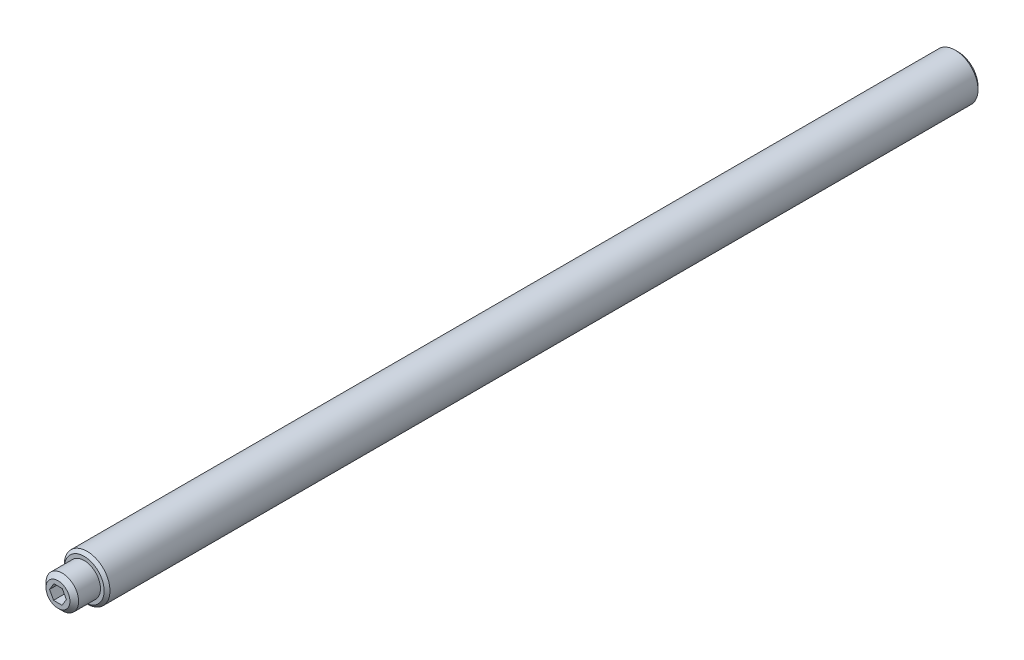
ISO-10303-21;
HEADER;
FILE_DESCRIPTION(('STEP AP214'),'2;1');
FILE_NAME('part.step','',(''),(''),'','','');
FILE_SCHEMA(('AUTOMOTIVE_DESIGN { 1 0 10303 214 1 1 1 1 }'));
ENDSEC;
DATA;
#1=APPLICATION_CONTEXT('core data for automotive mechanical design processes');
#2=APPLICATION_PROTOCOL_DEFINITION('international standard','automotive_design',2000,#1);
#3=PRODUCT_CONTEXT('',#1,'mechanical');
#4=PRODUCT('Part','Part','',(#3));
#5=PRODUCT_RELATED_PRODUCT_CATEGORY('part','',(#4));
#6=PRODUCT_DEFINITION_FORMATION('','',#4);
#7=PRODUCT_DEFINITION_CONTEXT('part definition',#1,'design');
#8=PRODUCT_DEFINITION('design','',#6,#7);
#9=PRODUCT_DEFINITION_SHAPE('','',#8);
#10=(LENGTH_UNIT() NAMED_UNIT(*) SI_UNIT(.MILLI.,.METRE.));
#11=(NAMED_UNIT(*) PLANE_ANGLE_UNIT() SI_UNIT($,.RADIAN.));
#12=(NAMED_UNIT(*) SI_UNIT($,.STERADIAN.) SOLID_ANGLE_UNIT());
#13=UNCERTAINTY_MEASURE_WITH_UNIT(LENGTH_MEASURE(1.E-05),#10,'distance_accuracy_value','');
#14=(GEOMETRIC_REPRESENTATION_CONTEXT(3) GLOBAL_UNCERTAINTY_ASSIGNED_CONTEXT((#13)) GLOBAL_UNIT_ASSIGNED_CONTEXT((#10,
#11,#12)) REPRESENTATION_CONTEXT('',''));
#15=CARTESIAN_POINT('',(0.,0.,0.));
#16=DIRECTION('',(0.,0.,1.));
#17=DIRECTION('',(1.,0.,0.));
#18=AXIS2_PLACEMENT_3D('',#15,#16,#17);
#19=CARTESIAN_POINT('',(0.,0.,38.1));
#20=DIRECTION('',(0.,0.,-1.));
#21=DIRECTION('',(-1.,0.,0.));
#22=AXIS2_PLACEMENT_3D('',#19,#20,#21);
#23=CYLINDRICAL_SURFACE('',#22,1.9939);
#24=CARTESIAN_POINT('',(0.,0.,37.846));
#25=DIRECTION('',(0.,0.,1.));
#26=DIRECTION('',(1.,0.,0.));
#27=AXIS2_PLACEMENT_3D('',#24,#25,#26);
#28=CIRCLE('',#27,1.9939);
#29=CARTESIAN_POINT('',(-1.9939,0.,37.846));
#30=VERTEX_POINT('',#29);
#31=EDGE_CURVE('P0_E11',#30,#30,#28,.F.);
#32=CARTESIAN_POINT('',(0.,0.,-37.846));
#33=DIRECTION('',(0.,0.,1.));
#34=DIRECTION('',(1.,0.,0.));
#35=AXIS2_PLACEMENT_3D('',#32,#33,#34);
#36=CIRCLE('',#35,1.9939);
#37=CARTESIAN_POINT('',(-1.9939,0.,-37.846));
#38=VERTEX_POINT('',#37);
#39=EDGE_CURVE('P0_E63',#38,#38,#36,.T.);
#40=CARTESIAN_POINT('',(-1.9939,0.,37.846));
#41=CARTESIAN_POINT('',(-1.9939,0.,37.0575416666667));
#42=CARTESIAN_POINT('',(-1.9939,0.,36.2690833333334));
#43=CARTESIAN_POINT('',(-1.9939,0.,34.6921666666667));
#44=CARTESIAN_POINT('',(-1.9939,0.,33.9037083333334));
#45=CARTESIAN_POINT('',(-1.9939,0.,32.3267916666667));
#46=CARTESIAN_POINT('',(-1.9939,0.,31.5383333333334));
#47=CARTESIAN_POINT('',(-1.9939,0.,29.9614166666667));
#48=CARTESIAN_POINT('',(-1.9939,0.,29.1729583333334));
#49=CARTESIAN_POINT('',(-1.9939,0.,27.5960416666667));
#50=CARTESIAN_POINT('',(-1.9939,0.,26.8075833333334));
#51=CARTESIAN_POINT('',(-1.9939,0.,25.2306666666667));
#52=CARTESIAN_POINT('',(-1.9939,0.,24.4422083333334));
#53=CARTESIAN_POINT('',(-1.9939,0.,22.8652916666667));
#54=CARTESIAN_POINT('',(-1.9939,0.,22.0768333333334));
#55=CARTESIAN_POINT('',(-1.9939,0.,20.4999166666667));
#56=CARTESIAN_POINT('',(-1.9939,0.,19.7114583333334));
#57=CARTESIAN_POINT('',(-1.9939,0.,18.1345416666667));
#58=CARTESIAN_POINT('',(-1.9939,0.,17.3460833333334));
#59=CARTESIAN_POINT('',(-1.9939,0.,15.7691666666667));
#60=CARTESIAN_POINT('',(-1.9939,0.,14.9807083333334));
#61=CARTESIAN_POINT('',(-1.9939,0.,13.4037916666667));
#62=CARTESIAN_POINT('',(-1.9939,0.,12.6153333333334));
#63=CARTESIAN_POINT('',(-1.9939,0.,11.0384166666667));
#64=CARTESIAN_POINT('',(-1.9939,0.,10.2499583333334));
#65=CARTESIAN_POINT('',(-1.9939,0.,8.6730416666667));
#66=CARTESIAN_POINT('',(-1.9939,0.,7.88458333333336));
#67=CARTESIAN_POINT('',(-1.9939,0.,6.30766666666669));
#68=CARTESIAN_POINT('',(-1.9939,0.,5.51920833333336));
#69=CARTESIAN_POINT('',(-1.9939,0.,3.94229166666669));
#70=CARTESIAN_POINT('',(-1.9939,0.,3.15383333333336));
#71=CARTESIAN_POINT('',(-1.9939,0.,1.5769166666667));
#72=CARTESIAN_POINT('',(-1.9939,0.,0.788458333333362));
#73=CARTESIAN_POINT('',(-1.9939,0.,-0.788458333333307));
#74=CARTESIAN_POINT('',(-1.9939,0.,-1.57691666666664));
#75=CARTESIAN_POINT('',(-1.9939,0.,-3.15383333333331));
#76=CARTESIAN_POINT('',(-1.9939,0.,-3.94229166666664));
#77=CARTESIAN_POINT('',(-1.9939,0.,-5.51920833333331));
#78=CARTESIAN_POINT('',(-1.9939,0.,-6.30766666666664));
#79=CARTESIAN_POINT('',(-1.9939,0.,-7.88458333333331));
#80=CARTESIAN_POINT('',(-1.9939,0.,-8.67304166666664));
#81=CARTESIAN_POINT('',(-1.9939,0.,-10.2499583333333));
#82=CARTESIAN_POINT('',(-1.9939,0.,-11.0384166666666));
#83=CARTESIAN_POINT('',(-1.9939,0.,-12.6153333333333));
#84=CARTESIAN_POINT('',(-1.9939,0.,-13.4037916666666));
#85=CARTESIAN_POINT('',(-1.9939,0.,-14.9807083333333));
#86=CARTESIAN_POINT('',(-1.9939,0.,-15.7691666666666));
#87=CARTESIAN_POINT('',(-1.9939,0.,-17.3460833333333));
#88=CARTESIAN_POINT('',(-1.9939,0.,-18.1345416666666));
#89=CARTESIAN_POINT('',(-1.9939,0.,-19.7114583333333));
#90=CARTESIAN_POINT('',(-1.9939,0.,-20.4999166666666));
#91=CARTESIAN_POINT('',(-1.9939,0.,-22.0768333333333));
#92=CARTESIAN_POINT('',(-1.9939,0.,-22.8652916666666));
#93=CARTESIAN_POINT('',(-1.9939,0.,-24.4422083333333));
#94=CARTESIAN_POINT('',(-1.9939,0.,-25.2306666666666));
#95=CARTESIAN_POINT('',(-1.9939,0.,-26.8075833333333));
#96=CARTESIAN_POINT('',(-1.9939,0.,-27.5960416666666));
#97=CARTESIAN_POINT('',(-1.9939,0.,-29.1729583333333));
#98=CARTESIAN_POINT('',(-1.9939,0.,-29.9614166666666));
#99=CARTESIAN_POINT('',(-1.9939,0.,-31.5383333333333));
#100=CARTESIAN_POINT('',(-1.9939,0.,-32.3267916666666));
#101=CARTESIAN_POINT('',(-1.9939,0.,-33.9037083333333));
#102=CARTESIAN_POINT('',(-1.9939,0.,-34.6921666666666));
#103=CARTESIAN_POINT('',(-1.9939,0.,-36.2690833333333));
#104=CARTESIAN_POINT('',(-1.9939,0.,-37.0575416666666));
#105=CARTESIAN_POINT('',(-1.9939,0.,-37.846));
#106=B_SPLINE_CURVE_WITH_KNOTS('',3,(#40,#41,#42,#43,#44,#45,#46,#47,#48,#49,#50,#51,#52,#53,
#54,#55,#56,#57,#58,#59,#60,#61,#62,#63,#64,#65,#66,#67,#68,#69,#70,#71,#72,#73,#74,#75,#76,#77,
#78,#79,#80,#81,#82,#83,#84,#85,#86,#87,#88,#89,#90,#91,#92,#93,#94,#95,#96,#97,#98,#99,#100,
#101,#102,#103,#104,#105),.UNSPECIFIED.,.F.,.F.,(4,2,2,2,2,2,2,2,2,2,2,2,2,2,2,2,2,2,2,2,2,2,2,
2,2,2,2,2,2,2,2,2,4),(0.,2.365375,4.73075,7.09612499999999,9.4615,11.826875,14.19225,16.557625,
18.923,21.288375,23.65375,26.019125,28.3845,30.749875,33.11525,35.480625,37.846,40.211375,
42.57675,44.942125,47.3075,49.672875,52.03825,54.403625,56.769,59.134375,61.49975,63.865125,
66.2305,68.595875,70.96125,73.326625,75.692),.UNSPECIFIED.);
#107=EDGE_CURVE('P0_BSEAM17',#30,#38,#106,.T.);
#108=ORIENTED_EDGE('',*,*,#31,.T.);
#109=ORIENTED_EDGE('',*,*,#39,.T.);
#110=ORIENTED_EDGE('',*,*,#107,.T.);
#111=ORIENTED_EDGE('',*,*,#107,.F.);
#112=EDGE_LOOP('',(#108,#110,#109,#111));
#113=FACE_BOUND('',#112,.T.);
#114=ADVANCED_FACE('P0_F17',(#113),#23,.T.);
#115=CARTESIAN_POINT('',(0.,0.,38.1));
#116=DIRECTION('',(0.,0.,1.));
#117=DIRECTION('',(1.,0.,0.));
#118=AXIS2_PLACEMENT_3D('',#115,#116,#117);
#119=PLANE('',#118);
#120=CARTESIAN_POINT('',(0.,0.,38.1));
#121=DIRECTION('',(0.,0.,1.));
#122=DIRECTION('',(1.,0.,0.));
#123=AXIS2_PLACEMENT_3D('',#120,#121,#122);
#124=CIRCLE('',#123,1.42239999999999);
#125=CARTESIAN_POINT('',(1.42239999999999,0.,38.1));
#126=VERTEX_POINT('',#125);
#127=EDGE_CURVE('P0_E60',#126,#126,#124,.T.);
#128=ORIENTED_EDGE('',*,*,#127,.F.);
#129=EDGE_LOOP('',(#128));
#130=FACE_BOUND('',#129,.T.);
#131=CARTESIAN_POINT('',(0.,0.,38.1));
#132=DIRECTION('',(0.,0.,1.));
#133=DIRECTION('',(1.,0.,0.));
#134=AXIS2_PLACEMENT_3D('',#131,#132,#133);
#135=CIRCLE('',#134,1.73990000000003);
#136=CARTESIAN_POINT('',(1.73990000000003,0.,38.1));
#137=VERTEX_POINT('',#136);
#138=EDGE_CURVE('P0_E25',#137,#137,#135,.T.);
#139=ORIENTED_EDGE('',*,*,#138,.T.);
#140=EDGE_LOOP('',(#139));
#141=FACE_BOUND('',#140,.T.);
#142=ADVANCED_FACE('P0_F71',(#130,#141),#119,.T.);
#143=CARTESIAN_POINT('',(0.,0.,-38.1));
#144=DIRECTION('',(0.,0.,1.));
#145=DIRECTION('',(1.,0.,0.));
#146=AXIS2_PLACEMENT_3D('',#143,#144,#145);
#147=PLANE('',#146);
#148=CARTESIAN_POINT('',(0.,0.,-38.1));
#149=DIRECTION('',(0.,0.,-1.));
#150=DIRECTION('',(-1.,0.,0.));
#151=AXIS2_PLACEMENT_3D('',#148,#149,#150);
#152=CIRCLE('',#151,1.42239999999999);
#153=CARTESIAN_POINT('',(-1.42239999999999,0.,-38.1));
#154=VERTEX_POINT('',#153);
#155=EDGE_CURVE('P0_E48',#154,#154,#152,.T.);
#156=ORIENTED_EDGE('',*,*,#155,.F.);
#157=EDGE_LOOP('',(#156));
#158=FACE_BOUND('',#157,.T.);
#159=CARTESIAN_POINT('',(0.,0.,-38.1));
#160=DIRECTION('',(0.,0.,1.));
#161=DIRECTION('',(1.,0.,0.));
#162=AXIS2_PLACEMENT_3D('',#159,#160,#161);
#163=CIRCLE('',#162,1.73989999999995);
#164=CARTESIAN_POINT('',(1.73989999999995,0.,-38.1));
#165=VERTEX_POINT('',#164);
#166=EDGE_CURVE('P0_E66',#165,#165,#163,.F.);
#167=ORIENTED_EDGE('',*,*,#166,.T.);
#168=EDGE_LOOP('',(#167));
#169=FACE_BOUND('',#168,.T.);
#170=ADVANCED_FACE('P0_F85',(#158,#169),#147,.F.);
#171=CARTESIAN_POINT('',(0.,0.,-37.846));
#172=DIRECTION('',(0.,0.,1.));
#173=DIRECTION('',(1.,0.,0.));
#174=AXIS2_PLACEMENT_3D('',#171,#172,#173);
#175=CONICAL_SURFACE('',#174,1.9939,0.785398163397463);
#176=ORIENTED_EDGE('',*,*,#166,.F.);
#177=EDGE_LOOP('',(#176));
#178=FACE_BOUND('',#177,.T.);
#179=ORIENTED_EDGE('',*,*,#39,.F.);
#180=EDGE_LOOP('',(#179));
#181=FACE_BOUND('',#180,.T.);
#182=ADVANCED_FACE('P0_F75',(#178,#181),#175,.T.);
#183=CARTESIAN_POINT('',(0.,0.,38.1));
#184=DIRECTION('',(0.,0.,-1.));
#185=DIRECTION('',(-1.,0.,0.));
#186=AXIS2_PLACEMENT_3D('',#183,#184,#185);
#187=CONICAL_SURFACE('',#186,1.73990000000003,0.785398163397449);
#188=ORIENTED_EDGE('',*,*,#31,.F.);
#189=EDGE_LOOP('',(#188));
#190=FACE_BOUND('',#189,.T.);
#191=ORIENTED_EDGE('',*,*,#138,.F.);
#192=EDGE_LOOP('',(#191));
#193=FACE_BOUND('',#192,.T.);
#194=ADVANCED_FACE('P0_F19',(#190,#193),#187,.T.);
#195=CARTESIAN_POINT('',(0.,0.,38.1));
#196=DIRECTION('',(0.,0.,1.));
#197=DIRECTION('',(1.,0.,0.));
#198=AXIS2_PLACEMENT_3D('',#195,#196,#197);
#199=CYLINDRICAL_SURFACE('',#198,1.4224);
#200=CARTESIAN_POINT('',(0.,0.,34.036));
#201=DIRECTION('',(0.,0.,1.));
#202=DIRECTION('',(1.,0.,0.));
#203=AXIS2_PLACEMENT_3D('',#200,#201,#202);
#204=CIRCLE('',#203,1.4224);
#205=CARTESIAN_POINT('',(1.4224,0.,34.036));
#206=VERTEX_POINT('',#205);
#207=EDGE_CURVE('P0_E57',#206,#206,#204,.T.);
#208=ORIENTED_EDGE('',*,*,#207,.F.);
#209=EDGE_LOOP('',(#208));
#210=FACE_BOUND('',#209,.T.);
#211=ORIENTED_EDGE('',*,*,#127,.T.);
#212=EDGE_LOOP('',(#211));
#213=FACE_BOUND('',#212,.T.);
#214=ADVANCED_FACE('P0_F74',(#210,#213),#199,.F.);
#215=CARTESIAN_POINT('',(1.1303,0.,34.036));
#216=DIRECTION('',(0.,0.,-1.));
#217=DIRECTION('',(-1.,0.,0.));
#218=AXIS2_PLACEMENT_3D('',#215,#216,#217);
#219=PLANE('',#218);
#220=CARTESIAN_POINT('',(0.,0.,34.036));
#221=DIRECTION('',(0.,0.,1.));
#222=DIRECTION('',(1.,0.,0.));
#223=AXIS2_PLACEMENT_3D('',#220,#221,#222);
#224=CIRCLE('',#223,1.1303);
#225=CARTESIAN_POINT('',(1.1303,0.,34.036));
#226=VERTEX_POINT('',#225);
#227=EDGE_CURVE('P0_E54',#226,#226,#224,.T.);
#228=ORIENTED_EDGE('',*,*,#227,.F.);
#229=EDGE_LOOP('',(#228));
#230=FACE_BOUND('',#229,.T.);
#231=ORIENTED_EDGE('',*,*,#207,.T.);
#232=EDGE_LOOP('',(#231));
#233=FACE_BOUND('',#232,.T.);
#234=ADVANCED_FACE('P0_F82',(#230,#233),#219,.F.);
#235=CARTESIAN_POINT('',(0.,0.,38.1));
#236=DIRECTION('',(0.,0.,1.));
#237=DIRECTION('',(1.,0.,0.));
#238=AXIS2_PLACEMENT_3D('',#235,#236,#237);
#239=CYLINDRICAL_SURFACE('',#238,1.1303);
#240=CARTESIAN_POINT('',(0.,0.,33.02));
#241=DIRECTION('',(0.,0.,1.));
#242=DIRECTION('',(1.,0.,0.));
#243=AXIS2_PLACEMENT_3D('',#240,#241,#242);
#244=CIRCLE('',#243,1.1303);
#245=CARTESIAN_POINT('',(1.1303,0.,33.02));
#246=VERTEX_POINT('',#245);
#247=EDGE_CURVE('P0_E51',#246,#246,#244,.T.);
#248=ORIENTED_EDGE('',*,*,#247,.F.);
#249=EDGE_LOOP('',(#248));
#250=FACE_BOUND('',#249,.T.);
#251=ORIENTED_EDGE('',*,*,#227,.T.);
#252=EDGE_LOOP('',(#251));
#253=FACE_BOUND('',#252,.T.);
#254=ADVANCED_FACE('P0_F103',(#250,#253),#239,.F.);
#255=CARTESIAN_POINT('',(0.,0.,33.02));
#256=DIRECTION('',(0.,0.,1.));
#257=DIRECTION('',(1.,0.,0.));
#258=AXIS2_PLACEMENT_3D('',#255,#256,#257);
#259=CONICAL_SURFACE('',#258,1.1303,1.02974425867665);
#260=CARTESIAN_POINT('',(0.,0.,32.3408472423131));
#261=VERTEX_POINT('',#260);
#262=VERTEX_LOOP('',#261);
#263=FACE_BOUND('',#262,.T.);
#264=ORIENTED_EDGE('',*,*,#247,.T.);
#265=EDGE_LOOP('',(#264));
#266=FACE_BOUND('',#265,.T.);
#267=ADVANCED_FACE('P0_F107',(#263,#266),#259,.F.);
#268=CARTESIAN_POINT('',(0.,0.,-38.1));
#269=DIRECTION('',(0.,0.,-1.));
#270=DIRECTION('',(-1.,0.,0.));
#271=AXIS2_PLACEMENT_3D('',#268,#269,#270);
#272=CYLINDRICAL_SURFACE('',#271,1.4224);
#273=CARTESIAN_POINT('',(0.,0.,-34.036));
#274=DIRECTION('',(0.,0.,-1.));
#275=DIRECTION('',(-1.,0.,0.));
#276=AXIS2_PLACEMENT_3D('',#273,#274,#275);
#277=CIRCLE('',#276,1.4224);
#278=CARTESIAN_POINT('',(-1.4224,0.,-34.036));
#279=VERTEX_POINT('',#278);
#280=EDGE_CURVE('P0_E43',#279,#279,#277,.T.);
#281=ORIENTED_EDGE('',*,*,#280,.F.);
#282=EDGE_LOOP('',(#281));
#283=FACE_BOUND('',#282,.T.);
#284=ORIENTED_EDGE('',*,*,#155,.T.);
#285=EDGE_LOOP('',(#284));
#286=FACE_BOUND('',#285,.T.);
#287=ADVANCED_FACE('P0_F111',(#283,#286),#272,.F.);
#288=CARTESIAN_POINT('',(1.1303,0.,-34.036));
#289=DIRECTION('',(0.,0.,1.));
#290=DIRECTION('',(1.,0.,0.));
#291=AXIS2_PLACEMENT_3D('',#288,#289,#290);
#292=PLANE('',#291);
#293=CARTESIAN_POINT('',(0.,0.,-34.036));
#294=DIRECTION('',(0.,0.,-1.));
#295=DIRECTION('',(-1.,0.,0.));
#296=AXIS2_PLACEMENT_3D('',#293,#294,#295);
#297=CIRCLE('',#296,1.1303);
#298=CARTESIAN_POINT('',(-1.1303,0.,-34.036));
#299=VERTEX_POINT('',#298);
#300=EDGE_CURVE('P0_E40',#299,#299,#297,.T.);
#301=ORIENTED_EDGE('',*,*,#300,.F.);
#302=EDGE_LOOP('',(#301));
#303=FACE_BOUND('',#302,.T.);
#304=ORIENTED_EDGE('',*,*,#280,.T.);
#305=EDGE_LOOP('',(#304));
#306=FACE_BOUND('',#305,.T.);
#307=ADVANCED_FACE('P0_F114',(#303,#306),#292,.F.);
#308=CARTESIAN_POINT('',(0.,0.,-38.1));
#309=DIRECTION('',(0.,0.,-1.));
#310=DIRECTION('',(-1.,0.,0.));
#311=AXIS2_PLACEMENT_3D('',#308,#309,#310);
#312=CYLINDRICAL_SURFACE('',#311,1.1303);
#313=CARTESIAN_POINT('',(0.,0.,-33.02));
#314=DIRECTION('',(0.,0.,-1.));
#315=DIRECTION('',(-1.,0.,0.));
#316=AXIS2_PLACEMENT_3D('',#313,#314,#315);
#317=CIRCLE('',#316,1.1303);
#318=CARTESIAN_POINT('',(-1.1303,0.,-33.02));
#319=VERTEX_POINT('',#318);
#320=EDGE_CURVE('P0_E38',#319,#319,#317,.T.);
#321=ORIENTED_EDGE('',*,*,#320,.F.);
#322=EDGE_LOOP('',(#321));
#323=FACE_BOUND('',#322,.T.);
#324=ORIENTED_EDGE('',*,*,#300,.T.);
#325=EDGE_LOOP('',(#324));
#326=FACE_BOUND('',#325,.T.);
#327=ADVANCED_FACE('P0_F34',(#323,#326),#312,.F.);
#328=CARTESIAN_POINT('',(0.,0.,-33.02));
#329=DIRECTION('',(0.,0.,-1.));
#330=DIRECTION('',(-1.,0.,0.));
#331=AXIS2_PLACEMENT_3D('',#328,#329,#330);
#332=CONICAL_SURFACE('',#331,1.1303,1.02974425867665);
#333=CARTESIAN_POINT('',(0.,0.,-32.3408472423131));
#334=VERTEX_POINT('',#333);
#335=VERTEX_LOOP('',#334);
#336=FACE_BOUND('',#335,.T.);
#337=ORIENTED_EDGE('',*,*,#320,.T.);
#338=EDGE_LOOP('',(#337));
#339=FACE_BOUND('',#338,.T.);
#340=ADVANCED_FACE('P0_F31',(#336,#339),#332,.F.);
#341=CLOSED_SHELL('',(#114,#142,#170,#182,#194,#214,#234,#254,#267,#287,#307,#327,#340));
#342=MANIFOLD_SOLID_BREP('P0_B1',#341);
#343=CARTESIAN_POINT('',(0.,0.,40.386));
#344=DIRECTION('',(0.,0.,1.));
#345=DIRECTION('',(0.999818778951505,-0.0190370495592458,0.));
#346=AXIS2_PLACEMENT_3D('',#343,#344,#345);
#347=PLANE('',#346);
#348=CARTESIAN_POINT('',(0.,0.,40.386));
#349=DIRECTION('',(0.,0.,1.));
#350=DIRECTION('',(0.999818778951505,-0.0190370495592458,0.));
#351=AXIS2_PLACEMENT_3D('',#348,#349,#350);
#352=CIRCLE('',#351,1.04394);
#353=CARTESIAN_POINT('',(1.04375081609864,-0.019873537516879,40.386));
#354=VERTEX_POINT('',#353);
#355=EDGE_CURVE('P1_E11',#354,#354,#352,.T.);
#356=ORIENTED_EDGE('',*,*,#355,.T.);
#357=EDGE_LOOP('',(#356));
#358=FACE_BOUND('',#357,.T.);
#359=DIRECTION('',(-0.999818778951505,0.0190370495592456,0.));
#360=VECTOR('',#359,1.);
#361=CARTESIAN_POINT('',(0.378639508612116,0.62790561062258,40.386));
#362=LINE('',#361,#360);
#363=CARTESIAN_POINT('',(0.378639508612116,0.62790561062258,40.386));
#364=VERTEX_POINT('',#363);
#365=CARTESIAN_POINT('',(-0.354462455671872,0.64186423864584,40.386));
#366=VERTEX_POINT('',#365);
#367=EDGE_CURVE('P1_E78',#364,#366,#362,.T.);
#368=ORIENTED_EDGE('',*,*,#367,.F.);
#369=DIRECTION('',(0.483422820944343,-0.875386986532364,0.));
#370=VECTOR('',#369,1.);
#371=CARTESIAN_POINT('',(0.378639508612116,0.62790561062258,40.386));
#372=LINE('',#371,#370);
#373=CARTESIAN_POINT('',(0.733101964283989,-0.0139586280232562,40.386));
#374=VERTEX_POINT('',#373);
#375=EDGE_CURVE('P1_E31',#364,#374,#372,.T.);
#376=ORIENTED_EDGE('',*,*,#375,.T.);
#377=DIRECTION('',(0.516395958007163,0.856349936973119,0.));
#378=VECTOR('',#377,1.);
#379=CARTESIAN_POINT('',(0.354462455671874,-0.641864238645832,40.386));
#380=LINE('',#379,#378);
#381=CARTESIAN_POINT('',(0.354462455671874,-0.641864238645832,40.386));
#382=VERTEX_POINT('',#381);
#383=EDGE_CURVE('P1_E84',#382,#374,#380,.T.);
#384=ORIENTED_EDGE('',*,*,#383,.F.);
#385=DIRECTION('',(-0.999818778951505,0.0190370495592458,0.));
#386=VECTOR('',#385,1.);
#387=CARTESIAN_POINT('',(0.354462455671874,-0.641864238645832,40.386));
#388=LINE('',#387,#386);
#389=CARTESIAN_POINT('',(-0.378639508612114,-0.627905610622571,40.386));
#390=VERTEX_POINT('',#389);
#391=EDGE_CURVE('P1_E104',#382,#390,#388,.T.);
#392=ORIENTED_EDGE('',*,*,#391,.T.);
#393=DIRECTION('',(-0.483422820944343,0.875386986532364,0.));
#394=VECTOR('',#393,1.);
#395=CARTESIAN_POINT('',(-0.378639508612114,-0.627905610622571,40.386));
#396=LINE('',#395,#394);
#397=CARTESIAN_POINT('',(-0.733101964283987,0.0139586280232649,40.386));
#398=VERTEX_POINT('',#397);
#399=EDGE_CURVE('P1_E107',#390,#398,#396,.T.);
#400=ORIENTED_EDGE('',*,*,#399,.T.);
#401=DIRECTION('',(-0.516395958007163,-0.856349936973119,0.));
#402=VECTOR('',#401,1.);
#403=CARTESIAN_POINT('',(-0.354462455671872,0.64186423864584,40.386));
#404=LINE('',#403,#402);
#405=EDGE_CURVE('P1_E110',#366,#398,#404,.T.);
#406=ORIENTED_EDGE('',*,*,#405,.F.);
#407=EDGE_LOOP('',(#368,#376,#384,#392,#400,#406));
#408=FACE_BOUND('',#407,.T.);
#409=ADVANCED_FACE('P1_F17',(#358,#408),#347,.T.);
#410=CARTESIAN_POINT('',(0.,0.,40.386));
#411=DIRECTION('',(0.,0.,-1.));
#412=DIRECTION('',(-0.999818778951505,0.0190370495592458,0.));
#413=AXIS2_PLACEMENT_3D('',#410,#411,#412);
#414=CONICAL_SURFACE('',#413,1.04394,0.785398163397426);
#415=CARTESIAN_POINT('',(0.,0.,40.00754));
#416=DIRECTION('',(0.,0.,1.));
#417=DIRECTION('',(0.999818778951505,-0.0190370495592458,0.));
#418=AXIS2_PLACEMENT_3D('',#415,#416,#417);
#419=CIRCLE('',#418,1.4224);
#420=CARTESIAN_POINT('',(1.42214223118062,-0.0270782992930711,40.00754));
#421=VERTEX_POINT('',#420);
#422=EDGE_CURVE('P1_E24',#421,#421,#419,.T.);
#423=ORIENTED_EDGE('',*,*,#422,.T.);
#424=EDGE_LOOP('',(#423));
#425=FACE_BOUND('',#424,.T.);
#426=ORIENTED_EDGE('',*,*,#355,.F.);
#427=EDGE_LOOP('',(#426));
#428=FACE_BOUND('',#427,.T.);
#429=ADVANCED_FACE('P1_F130',(#425,#428),#414,.T.);
#430=CARTESIAN_POINT('',(0.,0.,53.086));
#431=DIRECTION('',(0.,0.,1.));
#432=DIRECTION('',(0.999818778951505,-0.0190370495592458,0.));
#433=AXIS2_PLACEMENT_3D('',#430,#431,#432);
#434=CYLINDRICAL_SURFACE('',#433,1.4224);
#435=CARTESIAN_POINT('',(0.,0.,34.6837));
#436=DIRECTION('',(0.,0.,1.));
#437=DIRECTION('',(0.999818778951505,-0.0190370495592458,0.));
#438=AXIS2_PLACEMENT_3D('',#435,#436,#437);
#439=CIRCLE('',#438,1.4224);
#440=CARTESIAN_POINT('',(1.42214223118062,-0.0270782992930711,34.6837));
#441=VERTEX_POINT('',#440);
#442=EDGE_CURVE('P1_E125',#441,#441,#439,.T.);
#443=ORIENTED_EDGE('',*,*,#442,.T.);
#444=EDGE_LOOP('',(#443));
#445=FACE_BOUND('',#444,.T.);
#446=ORIENTED_EDGE('',*,*,#422,.F.);
#447=EDGE_LOOP('',(#446));
#448=FACE_BOUND('',#447,.T.);
#449=ADVANCED_FACE('P1_F133',(#445,#448),#434,.T.);
#450=CARTESIAN_POINT('',(0.,0.,34.6837));
#451=DIRECTION('',(0.,0.,1.));
#452=DIRECTION('',(0.999818778951505,-0.0190370495592458,0.));
#453=AXIS2_PLACEMENT_3D('',#450,#451,#452);
#454=CONICAL_SURFACE('',#453,1.4224,0.785398163397453);
#455=CARTESIAN_POINT('',(0.,0.,34.036));
#456=DIRECTION('',(0.,0.,1.));
#457=DIRECTION('',(0.999818778951505,-0.0190370495592458,0.));
#458=AXIS2_PLACEMENT_3D('',#455,#456,#457);
#459=CIRCLE('',#458,0.7747);
#460=CARTESIAN_POINT('',(0.774559608053731,-0.0147480022935476,34.036));
#461=VERTEX_POINT('',#460);
#462=EDGE_CURVE('P1_E85',#461,#461,#459,.T.);
#463=ORIENTED_EDGE('',*,*,#462,.T.);
#464=EDGE_LOOP('',(#463));
#465=FACE_BOUND('',#464,.T.);
#466=ORIENTED_EDGE('',*,*,#442,.F.);
#467=EDGE_LOOP('',(#466));
#468=FACE_BOUND('',#467,.T.);
#469=ADVANCED_FACE('P1_F135',(#465,#468),#454,.T.);
#470=CARTESIAN_POINT('',(0.,0.,34.5014867215607));
#471=DIRECTION('',(0.,0.,-1.));
#472=DIRECTION('',(-0.999818778951505,0.0190370495592458,0.));
#473=AXIS2_PLACEMENT_3D('',#470,#471,#472);
#474=CONICAL_SURFACE('',#473,0.,1.02974425867666);
#475=ORIENTED_EDGE('',*,*,#462,.F.);
#476=EDGE_LOOP('',(#475));
#477=FACE_BOUND('',#476,.T.);
#478=CARTESIAN_POINT('',(0.,0.,34.5014867215607));
#479=VERTEX_POINT('',#478);
#480=VERTEX_LOOP('',#479);
#481=FACE_BOUND('',#480,.T.);
#482=ADVANCED_FACE('P1_F143',(#477,#481),#474,.F.);
#483=CARTESIAN_POINT('',(0.378639508612116,0.62790561062258,38.608));
#484=DIRECTION('',(-0.875386986532364,-0.483422820944343,0.));
#485=DIRECTION('',(-0.483422820944343,0.875386986532365,0.));
#486=AXIS2_PLACEMENT_3D('',#483,#484,#485);
#487=PLANE('',#486);
#488=ORIENTED_EDGE('',*,*,#375,.F.);
#489=DIRECTION('',(0.,0.,1.));
#490=VECTOR('',#489,1.);
#491=CARTESIAN_POINT('',(0.378639508612116,0.62790561062258,38.608));
#492=LINE('',#491,#490);
#493=CARTESIAN_POINT('',(0.378639508612116,0.62790561062258,38.608));
#494=VERTEX_POINT('',#493);
#495=EDGE_CURVE('P1_E72',#494,#364,#492,.T.);
#496=ORIENTED_EDGE('',*,*,#495,.F.);
#497=DIRECTION('',(0.483422820944343,-0.875386986532364,0.));
#498=VECTOR('',#497,1.);
#499=CARTESIAN_POINT('',(0.378639508612116,0.62790561062258,38.608));
#500=LINE('',#499,#498);
#501=CARTESIAN_POINT('',(0.733101964283989,-0.0139586280232562,38.608));
#502=VERTEX_POINT('',#501);
#503=EDGE_CURVE('P1_E67',#494,#502,#500,.T.);
#504=ORIENTED_EDGE('',*,*,#503,.T.);
#505=DIRECTION('',(0.,0.,1.));
#506=VECTOR('',#505,1.);
#507=CARTESIAN_POINT('',(0.733101964283989,-0.0139586280232562,38.608));
#508=LINE('',#507,#506);
#509=EDGE_CURVE('P1_E70',#502,#374,#508,.T.);
#510=ORIENTED_EDGE('',*,*,#509,.T.);
#511=EDGE_LOOP('',(#488,#496,#504,#510));
#512=FACE_BOUND('',#511,.T.);
#513=ADVANCED_FACE('P1_F69',(#512),#487,.T.);
#514=CARTESIAN_POINT('',(0.354462455671874,-0.641864238645832,38.608));
#515=DIRECTION('',(0.856349936973119,-0.516395958007163,0.));
#516=DIRECTION('',(-0.516395958007163,-0.856349936973119,0.));
#517=AXIS2_PLACEMENT_3D('',#514,#515,#516);
#518=PLANE('',#517);
#519=ORIENTED_EDGE('',*,*,#383,.T.);
#520=ORIENTED_EDGE('',*,*,#509,.F.);
#521=DIRECTION('',(0.516395958007163,0.856349936973119,0.));
#522=VECTOR('',#521,1.);
#523=CARTESIAN_POINT('',(0.354462455671874,-0.641864238645832,38.608));
#524=LINE('',#523,#522);
#525=CARTESIAN_POINT('',(0.354462455671874,-0.641864238645832,38.608));
#526=VERTEX_POINT('',#525);
#527=EDGE_CURVE('P1_E77',#526,#502,#524,.T.);
#528=ORIENTED_EDGE('',*,*,#527,.F.);
#529=DIRECTION('',(0.,0.,1.));
#530=VECTOR('',#529,1.);
#531=CARTESIAN_POINT('',(0.354462455671874,-0.641864238645832,38.608));
#532=LINE('',#531,#530);
#533=EDGE_CURVE('P1_E86',#526,#382,#532,.T.);
#534=ORIENTED_EDGE('',*,*,#533,.T.);
#535=EDGE_LOOP('',(#519,#520,#528,#534));
#536=FACE_BOUND('',#535,.T.);
#537=ADVANCED_FACE('P1_F82',(#536),#518,.F.);
#538=CARTESIAN_POINT('',(0.354462455671874,-0.641864238645832,38.608));
#539=DIRECTION('',(0.0190370495592458,0.999818778951505,0.));
#540=DIRECTION('',(0.999818778951505,-0.0190370495592458,0.));
#541=AXIS2_PLACEMENT_3D('',#538,#539,#540);
#542=PLANE('',#541);
#543=ORIENTED_EDGE('',*,*,#391,.F.);
#544=ORIENTED_EDGE('',*,*,#533,.F.);
#545=DIRECTION('',(-0.999818778951505,0.0190370495592458,0.));
#546=VECTOR('',#545,1.);
#547=CARTESIAN_POINT('',(0.354462455671874,-0.641864238645832,38.608));
#548=LINE('',#547,#546);
#549=CARTESIAN_POINT('',(-0.378639508612114,-0.627905610622571,38.608));
#550=VERTEX_POINT('',#549);
#551=EDGE_CURVE('P1_E91',#526,#550,#548,.T.);
#552=ORIENTED_EDGE('',*,*,#551,.T.);
#553=DIRECTION('',(0.,0.,1.));
#554=VECTOR('',#553,1.);
#555=CARTESIAN_POINT('',(-0.378639508612114,-0.627905610622571,38.608));
#556=LINE('',#555,#554);
#557=EDGE_CURVE('P1_E120',#550,#390,#556,.T.);
#558=ORIENTED_EDGE('',*,*,#557,.T.);
#559=EDGE_LOOP('',(#543,#544,#552,#558));
#560=FACE_BOUND('',#559,.T.);
#561=ADVANCED_FACE('P1_F166',(#560),#542,.T.);
#562=CARTESIAN_POINT('',(-0.378639508612114,-0.627905610622571,38.608));
#563=DIRECTION('',(0.875386986532365,0.483422820944343,0.));
#564=DIRECTION('',(0.483422820944343,-0.875386986532365,0.));
#565=AXIS2_PLACEMENT_3D('',#562,#563,#564);
#566=PLANE('',#565);
#567=ORIENTED_EDGE('',*,*,#399,.F.);
#568=ORIENTED_EDGE('',*,*,#557,.F.);
#569=DIRECTION('',(-0.483422820944343,0.875386986532364,0.));
#570=VECTOR('',#569,1.);
#571=CARTESIAN_POINT('',(-0.378639508612114,-0.627905610622571,38.608));
#572=LINE('',#571,#570);
#573=CARTESIAN_POINT('',(-0.733101964283987,0.0139586280232649,38.608));
#574=VERTEX_POINT('',#573);
#575=EDGE_CURVE('P1_E93',#550,#574,#572,.T.);
#576=ORIENTED_EDGE('',*,*,#575,.T.);
#577=DIRECTION('',(0.,0.,1.));
#578=VECTOR('',#577,1.);
#579=CARTESIAN_POINT('',(-0.733101964283987,0.0139586280232649,38.608));
#580=LINE('',#579,#578);
#581=EDGE_CURVE('P1_E118',#574,#398,#580,.T.);
#582=ORIENTED_EDGE('',*,*,#581,.T.);
#583=EDGE_LOOP('',(#567,#568,#576,#582));
#584=FACE_BOUND('',#583,.T.);
#585=ADVANCED_FACE('P1_F162',(#584),#566,.T.);
#586=CARTESIAN_POINT('',(-0.354462455671872,0.64186423864584,38.608));
#587=DIRECTION('',(-0.856349936973119,0.516395958007163,0.));
#588=DIRECTION('',(0.516395958007163,0.856349936973119,0.));
#589=AXIS2_PLACEMENT_3D('',#586,#587,#588);
#590=PLANE('',#589);
#591=ORIENTED_EDGE('',*,*,#405,.T.);
#592=ORIENTED_EDGE('',*,*,#581,.F.);
#593=DIRECTION('',(-0.516395958007163,-0.856349936973119,0.));
#594=VECTOR('',#593,1.);
#595=CARTESIAN_POINT('',(-0.354462455671872,0.64186423864584,38.608));
#596=LINE('',#595,#594);
#597=CARTESIAN_POINT('',(-0.354462455671872,0.64186423864584,38.608));
#598=VERTEX_POINT('',#597);
#599=EDGE_CURVE('P1_E97',#598,#574,#596,.T.);
#600=ORIENTED_EDGE('',*,*,#599,.F.);
#601=DIRECTION('',(0.,0.,1.));
#602=VECTOR('',#601,1.);
#603=CARTESIAN_POINT('',(-0.354462455671872,0.64186423864584,38.608));
#604=LINE('',#603,#602);
#605=EDGE_CURVE('P1_E116',#598,#366,#604,.T.);
#606=ORIENTED_EDGE('',*,*,#605,.T.);
#607=EDGE_LOOP('',(#591,#592,#600,#606));
#608=FACE_BOUND('',#607,.T.);
#609=ADVANCED_FACE('P1_F159',(#608),#590,.F.);
#610=CARTESIAN_POINT('',(0.378639508612116,0.62790561062258,38.608));
#611=DIRECTION('',(0.0190370495592456,0.999818778951505,0.));
#612=DIRECTION('',(0.999818778951505,-0.0190370495592456,0.));
#613=AXIS2_PLACEMENT_3D('',#610,#611,#612);
#614=PLANE('',#613);
#615=ORIENTED_EDGE('',*,*,#367,.T.);
#616=ORIENTED_EDGE('',*,*,#605,.F.);
#617=DIRECTION('',(-0.999818778951505,0.0190370495592456,0.));
#618=VECTOR('',#617,1.);
#619=CARTESIAN_POINT('',(0.378639508612116,0.62790561062258,38.608));
#620=LINE('',#619,#618);
#621=EDGE_CURVE('P1_E100',#494,#598,#620,.T.);
#622=ORIENTED_EDGE('',*,*,#621,.F.);
#623=ORIENTED_EDGE('',*,*,#495,.T.);
#624=EDGE_LOOP('',(#615,#616,#622,#623));
#625=FACE_BOUND('',#624,.T.);
#626=ADVANCED_FACE('P1_F155',(#625),#614,.F.);
#627=CARTESIAN_POINT('',(0.733101964283989,-0.0139586280232561,38.608));
#628=DIRECTION('',(0.,0.,1.));
#629=DIRECTION('',(0.999818778951505,-0.0190370495592458,0.));
#630=AXIS2_PLACEMENT_3D('',#627,#628,#629);
#631=PLANE('',#630);
#632=ORIENTED_EDGE('',*,*,#503,.F.);
#633=ORIENTED_EDGE('',*,*,#621,.T.);
#634=ORIENTED_EDGE('',*,*,#599,.T.);
#635=ORIENTED_EDGE('',*,*,#575,.F.);
#636=ORIENTED_EDGE('',*,*,#551,.F.);
#637=ORIENTED_EDGE('',*,*,#527,.T.);
#638=EDGE_LOOP('',(#632,#633,#634,#635,#636,#637));
#639=FACE_BOUND('',#638,.T.);
#640=ADVANCED_FACE('P1_F89',(#639),#631,.T.);
#641=CLOSED_SHELL('',(#409,#429,#449,#469,#482,#513,#537,#561,#585,#609,#626,#640));
#642=MANIFOLD_SOLID_BREP('P1_B1',#641);
#643=ADVANCED_BREP_SHAPE_REPRESENTATION('',(#18,#342,#642),#14);
#644=SHAPE_DEFINITION_REPRESENTATION(#9,#643);
ENDSEC;
END-ISO-10303-21;
